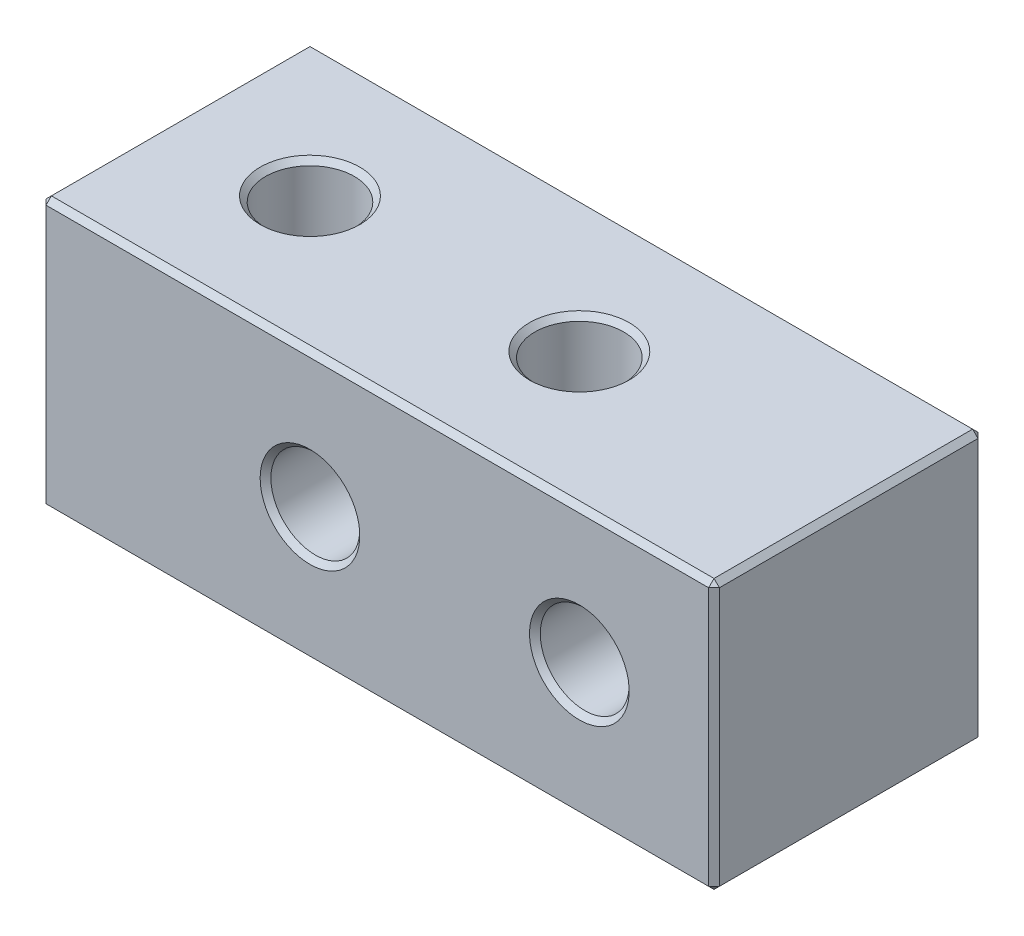
ISO-10303-21;
HEADER;
FILE_DESCRIPTION(('STEP AP214'),'2;1');
FILE_NAME('part.step','',(''),(''),'','','');
FILE_SCHEMA(('AUTOMOTIVE_DESIGN { 1 0 10303 214 1 1 1 1 }'));
ENDSEC;
DATA;
#1=APPLICATION_CONTEXT('core data for automotive mechanical design processes');
#2=APPLICATION_PROTOCOL_DEFINITION('international standard','automotive_design',2000,#1);
#3=PRODUCT_CONTEXT('',#1,'mechanical');
#4=PRODUCT('Part','Part','',(#3));
#5=PRODUCT_RELATED_PRODUCT_CATEGORY('part','',(#4));
#6=PRODUCT_DEFINITION_FORMATION('','',#4);
#7=PRODUCT_DEFINITION_CONTEXT('part definition',#1,'design');
#8=PRODUCT_DEFINITION('design','',#6,#7);
#9=PRODUCT_DEFINITION_SHAPE('','',#8);
#10=(LENGTH_UNIT() NAMED_UNIT(*) SI_UNIT(.MILLI.,.METRE.));
#11=(NAMED_UNIT(*) PLANE_ANGLE_UNIT() SI_UNIT($,.RADIAN.));
#12=(NAMED_UNIT(*) SI_UNIT($,.STERADIAN.) SOLID_ANGLE_UNIT());
#13=UNCERTAINTY_MEASURE_WITH_UNIT(LENGTH_MEASURE(1.E-05),#10,'distance_accuracy_value','');
#14=(GEOMETRIC_REPRESENTATION_CONTEXT(3) GLOBAL_UNCERTAINTY_ASSIGNED_CONTEXT((#13)) GLOBAL_UNIT_ASSIGNED_CONTEXT((#10,
#11,#12)) REPRESENTATION_CONTEXT('',''));
#15=CARTESIAN_POINT('',(0.,0.,0.));
#16=DIRECTION('',(0.,0.,1.));
#17=DIRECTION('',(1.,0.,0.));
#18=AXIS2_PLACEMENT_3D('',#15,#16,#17);
#19=CARTESIAN_POINT('',(12.5,5.,-5.));
#20=DIRECTION('',(-1.,0.,0.));
#21=DIRECTION('',(0.,0.,1.));
#22=AXIS2_PLACEMENT_3D('',#19,#20,#21);
#23=PLANE('',#22);
#24=DIRECTION('',(0.,-1.,0.));
#25=VECTOR('',#24,1.);
#26=CARTESIAN_POINT('',(12.5,5.,4.8));
#27=LINE('',#26,#25);
#28=CARTESIAN_POINT('',(12.5,4.8,4.8));
#29=VERTEX_POINT('',#28);
#30=CARTESIAN_POINT('',(12.5,-4.8,4.8));
#31=VERTEX_POINT('',#30);
#32=EDGE_CURVE('E241',#29,#31,#27,.T.);
#33=ORIENTED_EDGE('',*,*,#32,.T.);
#34=DIRECTION('',(0.,0.,-1.));
#35=VECTOR('',#34,1.);
#36=CARTESIAN_POINT('',(12.5,-4.8,-5.));
#37=LINE('',#36,#35);
#38=CARTESIAN_POINT('',(12.5,-4.8,-4.8));
#39=VERTEX_POINT('',#38);
#40=EDGE_CURVE('E243',#31,#39,#37,.T.);
#41=ORIENTED_EDGE('',*,*,#40,.T.);
#42=DIRECTION('',(0.,1.,0.));
#43=VECTOR('',#42,1.);
#44=CARTESIAN_POINT('',(12.5,5.,-4.8));
#45=LINE('',#44,#43);
#46=CARTESIAN_POINT('',(12.5,4.8,-4.8));
#47=VERTEX_POINT('',#46);
#48=EDGE_CURVE('E237',#39,#47,#45,.T.);
#49=ORIENTED_EDGE('',*,*,#48,.T.);
#50=DIRECTION('',(0.,0.,1.));
#51=VECTOR('',#50,1.);
#52=CARTESIAN_POINT('',(12.5,4.8,5.));
#53=LINE('',#52,#51);
#54=EDGE_CURVE('E239',#47,#29,#53,.T.);
#55=ORIENTED_EDGE('',*,*,#54,.T.);
#56=EDGE_LOOP('',(#33,#41,#49,#55));
#57=FACE_BOUND('',#56,.T.);
#58=ADVANCED_FACE('F41',(#57),#23,.F.);
#59=CARTESIAN_POINT('',(-12.5,5.,-5.));
#60=DIRECTION('',(0.,0.,1.));
#61=DIRECTION('',(1.,0.,0.));
#62=AXIS2_PLACEMENT_3D('',#59,#60,#61);
#63=PLANE('',#62);
#64=DIRECTION('',(1.,0.,0.));
#65=VECTOR('',#64,1.);
#66=CARTESIAN_POINT('',(12.5,4.8,-5.));
#67=LINE('',#66,#65);
#68=CARTESIAN_POINT('',(-12.3,4.8,-5.));
#69=VERTEX_POINT('',#68);
#70=CARTESIAN_POINT('',(12.3,4.8,-5.));
#71=VERTEX_POINT('',#70);
#72=EDGE_CURVE('E51',#69,#71,#67,.T.);
#73=ORIENTED_EDGE('',*,*,#72,.T.);
#74=DIRECTION('',(0.,-1.,0.));
#75=VECTOR('',#74,1.);
#76=CARTESIAN_POINT('',(12.3,5.,-5.));
#77=LINE('',#76,#75);
#78=CARTESIAN_POINT('',(12.3,-4.8,-5.));
#79=VERTEX_POINT('',#78);
#80=EDGE_CURVE('E11',#71,#79,#77,.T.);
#81=ORIENTED_EDGE('',*,*,#80,.T.);
#82=DIRECTION('',(-1.,0.,0.));
#83=VECTOR('',#82,1.);
#84=CARTESIAN_POINT('',(-12.5,-4.8,-5.));
#85=LINE('',#84,#83);
#86=CARTESIAN_POINT('',(-12.3,-4.8,-5.));
#87=VERTEX_POINT('',#86);
#88=EDGE_CURVE('E252',#79,#87,#85,.T.);
#89=ORIENTED_EDGE('',*,*,#88,.T.);
#90=DIRECTION('',(0.,1.,0.));
#91=VECTOR('',#90,1.);
#92=CARTESIAN_POINT('',(-12.3,5.,-5.));
#93=LINE('',#92,#91);
#94=EDGE_CURVE('E62',#87,#69,#93,.T.);
#95=ORIENTED_EDGE('',*,*,#94,.T.);
#96=EDGE_LOOP('',(#73,#81,#89,#95));
#97=FACE_BOUND('',#96,.T.);
#98=CARTESIAN_POINT('',(-2.49999999999999,0.,-5.));
#99=DIRECTION('',(0.,0.,1.));
#100=DIRECTION('',(1.,0.,0.));
#101=AXIS2_PLACEMENT_3D('',#98,#99,#100);
#102=CIRCLE('',#101,1.85);
#103=CARTESIAN_POINT('',(-0.649999999999993,0.,-5.));
#104=VERTEX_POINT('',#103);
#105=EDGE_CURVE('E249',#104,#104,#102,.T.);
#106=ORIENTED_EDGE('',*,*,#105,.T.);
#107=EDGE_LOOP('',(#106));
#108=FACE_BOUND('',#107,.T.);
#109=CARTESIAN_POINT('',(7.50000000000001,0.,-5.));
#110=DIRECTION('',(0.,0.,1.));
#111=DIRECTION('',(1.,0.,0.));
#112=AXIS2_PLACEMENT_3D('',#109,#110,#111);
#113=CIRCLE('',#112,1.85);
#114=CARTESIAN_POINT('',(9.35000000000001,0.,-5.));
#115=VERTEX_POINT('',#114);
#116=EDGE_CURVE('E246',#115,#115,#113,.T.);
#117=ORIENTED_EDGE('',*,*,#116,.T.);
#118=EDGE_LOOP('',(#117));
#119=FACE_BOUND('',#118,.T.);
#120=ADVANCED_FACE('F324',(#97,#108,#119),#63,.F.);
#121=CARTESIAN_POINT('',(-12.5,5.,-5.));
#122=DIRECTION('',(1.,0.,0.));
#123=DIRECTION('',(0.,0.,-1.));
#124=AXIS2_PLACEMENT_3D('',#121,#122,#123);
#125=PLANE('',#124);
#126=DIRECTION('',(0.,-1.,0.));
#127=VECTOR('',#126,1.);
#128=CARTESIAN_POINT('',(-12.5,5.,-4.8));
#129=LINE('',#128,#127);
#130=CARTESIAN_POINT('',(-12.5,4.8,-4.8));
#131=VERTEX_POINT('',#130);
#132=CARTESIAN_POINT('',(-12.5,-4.8,-4.8));
#133=VERTEX_POINT('',#132);
#134=EDGE_CURVE('E230',#131,#133,#129,.T.);
#135=ORIENTED_EDGE('',*,*,#134,.T.);
#136=DIRECTION('',(0.,0.,1.));
#137=VECTOR('',#136,1.);
#138=CARTESIAN_POINT('',(-12.5,-4.8,-5.));
#139=LINE('',#138,#137);
#140=CARTESIAN_POINT('',(-12.5,-4.8,4.8));
#141=VERTEX_POINT('',#140);
#142=EDGE_CURVE('E138',#133,#141,#139,.T.);
#143=ORIENTED_EDGE('',*,*,#142,.T.);
#144=DIRECTION('',(0.,1.,0.));
#145=VECTOR('',#144,1.);
#146=CARTESIAN_POINT('',(-12.5,5.,4.8));
#147=LINE('',#146,#145);
#148=CARTESIAN_POINT('',(-12.5,4.8,4.8));
#149=VERTEX_POINT('',#148);
#150=EDGE_CURVE('E234',#141,#149,#147,.T.);
#151=ORIENTED_EDGE('',*,*,#150,.T.);
#152=DIRECTION('',(0.,0.,-1.));
#153=VECTOR('',#152,1.);
#154=CARTESIAN_POINT('',(-12.5,4.8,-5.));
#155=LINE('',#154,#153);
#156=EDGE_CURVE('E232',#149,#131,#155,.T.);
#157=ORIENTED_EDGE('',*,*,#156,.T.);
#158=EDGE_LOOP('',(#135,#143,#151,#157));
#159=FACE_BOUND('',#158,.T.);
#160=ADVANCED_FACE('F381',(#159),#125,.F.);
#161=CARTESIAN_POINT('',(-12.5,5.,5.));
#162=DIRECTION('',(0.,0.,-1.));
#163=DIRECTION('',(-1.,0.,0.));
#164=AXIS2_PLACEMENT_3D('',#161,#162,#163);
#165=PLANE('',#164);
#166=CARTESIAN_POINT('',(-2.49999999999999,0.,5.));
#167=DIRECTION('',(0.,0.,-1.));
#168=DIRECTION('',(-1.,0.,0.));
#169=AXIS2_PLACEMENT_3D('',#166,#167,#168);
#170=CIRCLE('',#169,1.85);
#171=CARTESIAN_POINT('',(-4.34999999999999,0.,5.));
#172=VERTEX_POINT('',#171);
#173=EDGE_CURVE('E200',#172,#172,#170,.T.);
#174=ORIENTED_EDGE('',*,*,#173,.T.);
#175=EDGE_LOOP('',(#174));
#176=FACE_BOUND('',#175,.T.);
#177=CARTESIAN_POINT('',(7.50000000000001,0.,5.));
#178=DIRECTION('',(0.,0.,-1.));
#179=DIRECTION('',(-1.,0.,0.));
#180=AXIS2_PLACEMENT_3D('',#177,#178,#179);
#181=CIRCLE('',#180,1.85);
#182=CARTESIAN_POINT('',(5.65,0.,5.));
#183=VERTEX_POINT('',#182);
#184=EDGE_CURVE('E197',#183,#183,#181,.T.);
#185=ORIENTED_EDGE('',*,*,#184,.T.);
#186=EDGE_LOOP('',(#185));
#187=FACE_BOUND('',#186,.T.);
#188=DIRECTION('',(-1.,0.,0.));
#189=VECTOR('',#188,1.);
#190=CARTESIAN_POINT('',(-12.5,4.8,5.));
#191=LINE('',#190,#189);
#192=CARTESIAN_POINT('',(12.3,4.8,5.));
#193=VERTEX_POINT('',#192);
#194=CARTESIAN_POINT('',(-12.3,4.8,5.));
#195=VERTEX_POINT('',#194);
#196=EDGE_CURVE('E188',#193,#195,#191,.T.);
#197=ORIENTED_EDGE('',*,*,#196,.T.);
#198=DIRECTION('',(0.,-1.,0.));
#199=VECTOR('',#198,1.);
#200=CARTESIAN_POINT('',(-12.3,5.,5.));
#201=LINE('',#200,#199);
#202=CARTESIAN_POINT('',(-12.3,-4.8,5.));
#203=VERTEX_POINT('',#202);
#204=EDGE_CURVE('E194',#195,#203,#201,.T.);
#205=ORIENTED_EDGE('',*,*,#204,.T.);
#206=DIRECTION('',(1.,0.,0.));
#207=VECTOR('',#206,1.);
#208=CARTESIAN_POINT('',(-12.5,-4.8,5.));
#209=LINE('',#208,#207);
#210=CARTESIAN_POINT('',(12.3,-4.8,5.));
#211=VERTEX_POINT('',#210);
#212=EDGE_CURVE('E192',#203,#211,#209,.T.);
#213=ORIENTED_EDGE('',*,*,#212,.T.);
#214=DIRECTION('',(0.,1.,0.));
#215=VECTOR('',#214,1.);
#216=CARTESIAN_POINT('',(12.3,5.,5.));
#217=LINE('',#216,#215);
#218=EDGE_CURVE('E190',#211,#193,#217,.T.);
#219=ORIENTED_EDGE('',*,*,#218,.T.);
#220=EDGE_LOOP('',(#197,#205,#213,#219));
#221=FACE_BOUND('',#220,.T.);
#222=ADVANCED_FACE('F556',(#176,#187,#221),#165,.F.);
#223=CARTESIAN_POINT('',(0.,5.,0.));
#224=DIRECTION('',(0.,1.,0.));
#225=DIRECTION('',(0.,0.,1.));
#226=AXIS2_PLACEMENT_3D('',#223,#224,#225);
#227=PLANE('',#226);
#228=CARTESIAN_POINT('',(2.5,5.,0.));
#229=DIRECTION('',(0.,1.,0.));
#230=DIRECTION('',(0.,0.,1.));
#231=AXIS2_PLACEMENT_3D('',#228,#229,#230);
#232=CIRCLE('',#231,1.85);
#233=CARTESIAN_POINT('',(2.5,5.,1.85));
#234=VERTEX_POINT('',#233);
#235=EDGE_CURVE('E227',#234,#234,#232,.F.);
#236=ORIENTED_EDGE('',*,*,#235,.T.);
#237=EDGE_LOOP('',(#236));
#238=FACE_BOUND('',#237,.T.);
#239=CARTESIAN_POINT('',(-7.5,5.,0.));
#240=DIRECTION('',(0.,1.,0.));
#241=DIRECTION('',(0.,0.,1.));
#242=AXIS2_PLACEMENT_3D('',#239,#240,#241);
#243=CIRCLE('',#242,1.85);
#244=CARTESIAN_POINT('',(-7.5,5.,1.85));
#245=VERTEX_POINT('',#244);
#246=EDGE_CURVE('E224',#245,#245,#243,.F.);
#247=ORIENTED_EDGE('',*,*,#246,.T.);
#248=EDGE_LOOP('',(#247));
#249=FACE_BOUND('',#248,.T.);
#250=DIRECTION('',(0.,0.,1.));
#251=VECTOR('',#250,1.);
#252=CARTESIAN_POINT('',(-12.3,5.,5.));
#253=LINE('',#252,#251);
#254=CARTESIAN_POINT('',(-12.3,5.,-4.8));
#255=VERTEX_POINT('',#254);
#256=CARTESIAN_POINT('',(-12.3,5.,4.8));
#257=VERTEX_POINT('',#256);
#258=EDGE_CURVE('E219',#255,#257,#253,.T.);
#259=ORIENTED_EDGE('',*,*,#258,.T.);
#260=DIRECTION('',(1.,0.,0.));
#261=VECTOR('',#260,1.);
#262=CARTESIAN_POINT('',(12.5,5.,4.8));
#263=LINE('',#262,#261);
#264=CARTESIAN_POINT('',(12.3,5.,4.8));
#265=VERTEX_POINT('',#264);
#266=EDGE_CURVE('E221',#257,#265,#263,.T.);
#267=ORIENTED_EDGE('',*,*,#266,.T.);
#268=DIRECTION('',(0.,0.,-1.));
#269=VECTOR('',#268,1.);
#270=CARTESIAN_POINT('',(12.3,5.,-5.));
#271=LINE('',#270,#269);
#272=CARTESIAN_POINT('',(12.3,5.,-4.8));
#273=VERTEX_POINT('',#272);
#274=EDGE_CURVE('E217',#265,#273,#271,.T.);
#275=ORIENTED_EDGE('',*,*,#274,.T.);
#276=DIRECTION('',(-1.,0.,0.));
#277=VECTOR('',#276,1.);
#278=CARTESIAN_POINT('',(-12.5,5.,-4.8));
#279=LINE('',#278,#277);
#280=EDGE_CURVE('E215',#273,#255,#279,.T.);
#281=ORIENTED_EDGE('',*,*,#280,.T.);
#282=EDGE_LOOP('',(#259,#267,#275,#281));
#283=FACE_BOUND('',#282,.T.);
#284=ADVANCED_FACE('F338',(#238,#249,#283),#227,.T.);
#285=CARTESIAN_POINT('',(0.,-5.,0.));
#286=DIRECTION('',(0.,1.,0.));
#287=DIRECTION('',(0.,0.,1.));
#288=AXIS2_PLACEMENT_3D('',#285,#286,#287);
#289=PLANE('',#288);
#290=CARTESIAN_POINT('',(2.5,-5.,0.));
#291=DIRECTION('',(0.,1.,0.));
#292=DIRECTION('',(0.,0.,1.));
#293=AXIS2_PLACEMENT_3D('',#290,#291,#292);
#294=CIRCLE('',#293,1.85);
#295=CARTESIAN_POINT('',(2.5,-5.,1.85));
#296=VERTEX_POINT('',#295);
#297=EDGE_CURVE('E173',#296,#296,#294,.T.);
#298=ORIENTED_EDGE('',*,*,#297,.T.);
#299=EDGE_LOOP('',(#298));
#300=FACE_BOUND('',#299,.T.);
#301=CARTESIAN_POINT('',(-7.5,-5.,0.));
#302=DIRECTION('',(0.,1.,0.));
#303=DIRECTION('',(0.,0.,1.));
#304=AXIS2_PLACEMENT_3D('',#301,#302,#303);
#305=CIRCLE('',#304,1.85);
#306=CARTESIAN_POINT('',(-7.5,-5.,1.85));
#307=VERTEX_POINT('',#306);
#308=EDGE_CURVE('E167',#307,#307,#305,.T.);
#309=ORIENTED_EDGE('',*,*,#308,.T.);
#310=EDGE_LOOP('',(#309));
#311=FACE_BOUND('',#310,.T.);
#312=DIRECTION('',(0.,0.,1.));
#313=VECTOR('',#312,1.);
#314=CARTESIAN_POINT('',(12.3,-5.,0.));
#315=LINE('',#314,#313);
#316=CARTESIAN_POINT('',(12.3,-5.,-4.8));
#317=VERTEX_POINT('',#316);
#318=CARTESIAN_POINT('',(12.3,-5.,4.8));
#319=VERTEX_POINT('',#318);
#320=EDGE_CURVE('E160',#317,#319,#315,.T.);
#321=ORIENTED_EDGE('',*,*,#320,.T.);
#322=DIRECTION('',(-1.,0.,0.));
#323=VECTOR('',#322,1.);
#324=CARTESIAN_POINT('',(0.,-5.,4.8));
#325=LINE('',#324,#323);
#326=CARTESIAN_POINT('',(-12.3,-5.,4.8));
#327=VERTEX_POINT('',#326);
#328=EDGE_CURVE('E164',#319,#327,#325,.T.);
#329=ORIENTED_EDGE('',*,*,#328,.T.);
#330=DIRECTION('',(0.,0.,-1.));
#331=VECTOR('',#330,1.);
#332=CARTESIAN_POINT('',(-12.3,-5.,0.));
#333=LINE('',#332,#331);
#334=CARTESIAN_POINT('',(-12.3,-5.,-4.8));
#335=VERTEX_POINT('',#334);
#336=EDGE_CURVE('E135',#327,#335,#333,.T.);
#337=ORIENTED_EDGE('',*,*,#336,.T.);
#338=DIRECTION('',(1.,0.,0.));
#339=VECTOR('',#338,1.);
#340=CARTESIAN_POINT('',(0.,-5.,-4.8));
#341=LINE('',#340,#339);
#342=EDGE_CURVE('E154',#335,#317,#341,.T.);
#343=ORIENTED_EDGE('',*,*,#342,.T.);
#344=EDGE_LOOP('',(#321,#329,#337,#343));
#345=FACE_BOUND('',#344,.T.);
#346=ADVANCED_FACE('F162',(#300,#311,#345),#289,.F.);
#347=CARTESIAN_POINT('',(2.5,5.,0.));
#348=DIRECTION('',(0.,1.,0.));
#349=DIRECTION('',(0.,0.,1.));
#350=AXIS2_PLACEMENT_3D('',#347,#348,#349);
#351=CYLINDRICAL_SURFACE('',#350,1.65);
#352=CARTESIAN_POINT('',(2.5,-4.8,0.));
#353=DIRECTION('',(0.,1.,0.));
#354=DIRECTION('',(0.,0.,1.));
#355=AXIS2_PLACEMENT_3D('',#352,#353,#354);
#356=CIRCLE('',#355,1.65);
#357=CARTESIAN_POINT('',(2.5,-4.8,1.65));
#358=VERTEX_POINT('',#357);
#359=EDGE_CURVE('E179',#358,#358,#356,.F.);
#360=ORIENTED_EDGE('',*,*,#359,.T.);
#361=EDGE_LOOP('',(#360));
#362=FACE_BOUND('',#361,.T.);
#363=CARTESIAN_POINT('',(2.5,4.8,0.));
#364=DIRECTION('',(0.,1.,0.));
#365=DIRECTION('',(0.,0.,1.));
#366=AXIS2_PLACEMENT_3D('',#363,#364,#365);
#367=CIRCLE('',#366,1.65);
#368=CARTESIAN_POINT('',(2.5,4.8,1.65));
#369=VERTEX_POINT('',#368);
#370=EDGE_CURVE('E176',#369,#369,#367,.T.);
#371=ORIENTED_EDGE('',*,*,#370,.T.);
#372=EDGE_LOOP('',(#371));
#373=FACE_BOUND('',#372,.T.);
#374=ADVANCED_FACE('F547',(#362,#373),#351,.F.);
#375=CARTESIAN_POINT('',(-7.5,5.,0.));
#376=DIRECTION('',(0.,1.,0.));
#377=DIRECTION('',(0.,0.,1.));
#378=AXIS2_PLACEMENT_3D('',#375,#376,#377);
#379=CYLINDRICAL_SURFACE('',#378,1.65);
#380=CARTESIAN_POINT('',(-7.5,-4.8,0.));
#381=DIRECTION('',(0.,1.,0.));
#382=DIRECTION('',(0.,0.,1.));
#383=AXIS2_PLACEMENT_3D('',#380,#381,#382);
#384=CIRCLE('',#383,1.65);
#385=CARTESIAN_POINT('',(-7.5,-4.8,1.65));
#386=VERTEX_POINT('',#385);
#387=EDGE_CURVE('E185',#386,#386,#384,.F.);
#388=ORIENTED_EDGE('',*,*,#387,.T.);
#389=EDGE_LOOP('',(#388));
#390=FACE_BOUND('',#389,.T.);
#391=CARTESIAN_POINT('',(-7.5,4.8,0.));
#392=DIRECTION('',(0.,1.,0.));
#393=DIRECTION('',(0.,0.,1.));
#394=AXIS2_PLACEMENT_3D('',#391,#392,#393);
#395=CIRCLE('',#394,1.65);
#396=CARTESIAN_POINT('',(-7.5,4.8,1.65));
#397=VERTEX_POINT('',#396);
#398=EDGE_CURVE('E182',#397,#397,#395,.T.);
#399=ORIENTED_EDGE('',*,*,#398,.T.);
#400=EDGE_LOOP('',(#399));
#401=FACE_BOUND('',#400,.T.);
#402=ADVANCED_FACE('F538',(#390,#401),#379,.F.);
#403=CARTESIAN_POINT('',(-2.49999999999999,0.,-5.));
#404=DIRECTION('',(0.,0.,-1.));
#405=DIRECTION('',(-1.,0.,0.));
#406=AXIS2_PLACEMENT_3D('',#403,#404,#405);
#407=CYLINDRICAL_SURFACE('',#406,1.65);
#408=CARTESIAN_POINT('',(-2.49999999999999,0.,4.8));
#409=DIRECTION('',(0.,0.,-1.));
#410=DIRECTION('',(-1.,0.,0.));
#411=AXIS2_PLACEMENT_3D('',#408,#409,#410);
#412=CIRCLE('',#411,1.65);
#413=CARTESIAN_POINT('',(-4.14999999999999,0.,4.8));
#414=VERTEX_POINT('',#413);
#415=EDGE_CURVE('E206',#414,#414,#412,.F.);
#416=ORIENTED_EDGE('',*,*,#415,.T.);
#417=EDGE_LOOP('',(#416));
#418=FACE_BOUND('',#417,.T.);
#419=CARTESIAN_POINT('',(-2.49999999999999,0.,-4.8));
#420=DIRECTION('',(0.,0.,1.));
#421=DIRECTION('',(1.,0.,0.));
#422=AXIS2_PLACEMENT_3D('',#419,#420,#421);
#423=CIRCLE('',#422,1.65);
#424=CARTESIAN_POINT('',(-0.849999999999996,0.,-4.8));
#425=VERTEX_POINT('',#424);
#426=EDGE_CURVE('E203',#425,#425,#423,.F.);
#427=ORIENTED_EDGE('',*,*,#426,.T.);
#428=EDGE_LOOP('',(#427));
#429=FACE_BOUND('',#428,.T.);
#430=ADVANCED_FACE('F536',(#418,#429),#407,.F.);
#431=CARTESIAN_POINT('',(7.50000000000001,0.,-5.));
#432=DIRECTION('',(0.,0.,-1.));
#433=DIRECTION('',(-1.,0.,0.));
#434=AXIS2_PLACEMENT_3D('',#431,#432,#433);
#435=CYLINDRICAL_SURFACE('',#434,1.65);
#436=CARTESIAN_POINT('',(7.50000000000001,0.,4.8));
#437=DIRECTION('',(0.,0.,-1.));
#438=DIRECTION('',(-1.,0.,0.));
#439=AXIS2_PLACEMENT_3D('',#436,#437,#438);
#440=CIRCLE('',#439,1.65);
#441=CARTESIAN_POINT('',(5.85000000000001,0.,4.8));
#442=VERTEX_POINT('',#441);
#443=EDGE_CURVE('E212',#442,#442,#440,.F.);
#444=ORIENTED_EDGE('',*,*,#443,.T.);
#445=EDGE_LOOP('',(#444));
#446=FACE_BOUND('',#445,.T.);
#447=CARTESIAN_POINT('',(7.50000000000001,0.,-4.8));
#448=DIRECTION('',(0.,0.,1.));
#449=DIRECTION('',(1.,0.,0.));
#450=AXIS2_PLACEMENT_3D('',#447,#448,#449);
#451=CIRCLE('',#450,1.65);
#452=CARTESIAN_POINT('',(9.15000000000001,0.,-4.8));
#453=VERTEX_POINT('',#452);
#454=EDGE_CURVE('E209',#453,#453,#451,.F.);
#455=ORIENTED_EDGE('',*,*,#454,.T.);
#456=EDGE_LOOP('',(#455));
#457=FACE_BOUND('',#456,.T.);
#458=ADVANCED_FACE('F393',(#446,#457),#435,.F.);
#459=CARTESIAN_POINT('',(2.5,-5.,0.));
#460=DIRECTION('',(0.,-1.,0.));
#461=DIRECTION('',(0.,0.,-1.));
#462=AXIS2_PLACEMENT_3D('',#459,#460,#461);
#463=CONICAL_SURFACE('',#462,1.85,0.785398163397445);
#464=ORIENTED_EDGE('',*,*,#359,.F.);
#465=EDGE_LOOP('',(#464));
#466=FACE_BOUND('',#465,.T.);
#467=ORIENTED_EDGE('',*,*,#297,.F.);
#468=EDGE_LOOP('',(#467));
#469=FACE_BOUND('',#468,.T.);
#470=ADVANCED_FACE('F386',(#466,#469),#463,.F.);
#471=CARTESIAN_POINT('',(-7.5,-5.,0.));
#472=DIRECTION('',(0.,-1.,0.));
#473=DIRECTION('',(0.,0.,-1.));
#474=AXIS2_PLACEMENT_3D('',#471,#472,#473);
#475=CONICAL_SURFACE('',#474,1.85,0.785398163397445);
#476=ORIENTED_EDGE('',*,*,#387,.F.);
#477=EDGE_LOOP('',(#476));
#478=FACE_BOUND('',#477,.T.);
#479=ORIENTED_EDGE('',*,*,#308,.F.);
#480=EDGE_LOOP('',(#479));
#481=FACE_BOUND('',#480,.T.);
#482=ADVANCED_FACE('F392',(#478,#481),#475,.F.);
#483=CARTESIAN_POINT('',(-2.49999999999999,0.,5.));
#484=DIRECTION('',(0.,0.,1.));
#485=DIRECTION('',(1.,0.,0.));
#486=AXIS2_PLACEMENT_3D('',#483,#484,#485);
#487=CONICAL_SURFACE('',#486,1.85,0.785398163397445);
#488=ORIENTED_EDGE('',*,*,#415,.F.);
#489=EDGE_LOOP('',(#488));
#490=FACE_BOUND('',#489,.T.);
#491=ORIENTED_EDGE('',*,*,#173,.F.);
#492=EDGE_LOOP('',(#491));
#493=FACE_BOUND('',#492,.T.);
#494=ADVANCED_FACE('F400',(#490,#493),#487,.F.);
#495=CARTESIAN_POINT('',(7.50000000000001,0.,5.));
#496=DIRECTION('',(0.,0.,1.));
#497=DIRECTION('',(1.,0.,0.));
#498=AXIS2_PLACEMENT_3D('',#495,#496,#497);
#499=CONICAL_SURFACE('',#498,1.85,0.785398163397455);
#500=ORIENTED_EDGE('',*,*,#443,.F.);
#501=EDGE_LOOP('',(#500));
#502=FACE_BOUND('',#501,.T.);
#503=ORIENTED_EDGE('',*,*,#184,.F.);
#504=EDGE_LOOP('',(#503));
#505=FACE_BOUND('',#504,.T.);
#506=ADVANCED_FACE('F407',(#502,#505),#499,.F.);
#507=CARTESIAN_POINT('',(2.5,4.8,0.));
#508=DIRECTION('',(0.,1.,0.));
#509=DIRECTION('',(0.,0.,1.));
#510=AXIS2_PLACEMENT_3D('',#507,#508,#509);
#511=CONICAL_SURFACE('',#510,1.65,0.785398163397451);
#512=ORIENTED_EDGE('',*,*,#235,.F.);
#513=EDGE_LOOP('',(#512));
#514=FACE_BOUND('',#513,.T.);
#515=ORIENTED_EDGE('',*,*,#370,.F.);
#516=EDGE_LOOP('',(#515));
#517=FACE_BOUND('',#516,.T.);
#518=ADVANCED_FACE('F414',(#514,#517),#511,.F.);
#519=CARTESIAN_POINT('',(-7.5,4.8,0.));
#520=DIRECTION('',(0.,1.,0.));
#521=DIRECTION('',(0.,0.,1.));
#522=AXIS2_PLACEMENT_3D('',#519,#520,#521);
#523=CONICAL_SURFACE('',#522,1.65,0.785398163397451);
#524=ORIENTED_EDGE('',*,*,#246,.F.);
#525=EDGE_LOOP('',(#524));
#526=FACE_BOUND('',#525,.T.);
#527=ORIENTED_EDGE('',*,*,#398,.F.);
#528=EDGE_LOOP('',(#527));
#529=FACE_BOUND('',#528,.T.);
#530=ADVANCED_FACE('F421',(#526,#529),#523,.F.);
#531=CARTESIAN_POINT('',(12.3,5.,0.));
#532=DIRECTION('',(0.707106781186547,0.707106781186547,0.));
#533=DIRECTION('',(0.,0.,1.));
#534=AXIS2_PLACEMENT_3D('',#531,#532,#533);
#535=PLANE('',#534);
#536=DIRECTION('',(0.707106781186547,-0.707106781186547,0.));
#537=VECTOR('',#536,1.);
#538=CARTESIAN_POINT('',(12.3,5.,-4.8));
#539=LINE('',#538,#537);
#540=EDGE_CURVE('E46',#273,#47,#539,.T.);
#541=ORIENTED_EDGE('',*,*,#540,.F.);
#542=ORIENTED_EDGE('',*,*,#274,.F.);
#543=DIRECTION('',(-0.707106781186547,0.707106781186547,0.));
#544=VECTOR('',#543,1.);
#545=CARTESIAN_POINT('',(12.4,4.9,4.8));
#546=LINE('',#545,#544);
#547=EDGE_CURVE('E303',#29,#265,#546,.T.);
#548=ORIENTED_EDGE('',*,*,#547,.F.);
#549=ORIENTED_EDGE('',*,*,#54,.F.);
#550=EDGE_LOOP('',(#541,#542,#548,#549));
#551=FACE_BOUND('',#550,.T.);
#552=ADVANCED_FACE('F428',(#551),#535,.T.);
#553=CARTESIAN_POINT('',(12.3,5.,-4.8));
#554=DIRECTION('',(0.577350269189626,0.577350269189626,-0.577350269189626));
#555=DIRECTION('',(-0.707106781186547,0.,-0.707106781186547));
#556=AXIS2_PLACEMENT_3D('',#553,#554,#555);
#557=PLANE('',#556);
#558=DIRECTION('',(0.,0.707106781186547,0.707106781186547));
#559=VECTOR('',#558,1.);
#560=CARTESIAN_POINT('',(12.3,5.,-4.8));
#561=LINE('',#560,#559);
#562=EDGE_CURVE('E299',#273,#71,#561,.F.);
#563=ORIENTED_EDGE('',*,*,#562,.F.);
#564=ORIENTED_EDGE('',*,*,#540,.T.);
#565=DIRECTION('',(0.707106781186547,0.,0.707106781186547));
#566=VECTOR('',#565,1.);
#567=CARTESIAN_POINT('',(12.4,4.8,-4.9));
#568=LINE('',#567,#566);
#569=EDGE_CURVE('E301',#71,#47,#568,.T.);
#570=ORIENTED_EDGE('',*,*,#569,.F.);
#571=EDGE_LOOP('',(#563,#564,#570));
#572=FACE_BOUND('',#571,.T.);
#573=ADVANCED_FACE('F315',(#572),#557,.T.);
#574=CARTESIAN_POINT('',(12.3,4.8,5.));
#575=DIRECTION('',(0.577350269189626,0.577350269189626,0.577350269189626));
#576=DIRECTION('',(0.707106781186547,0.,-0.707106781186547));
#577=AXIS2_PLACEMENT_3D('',#574,#575,#576);
#578=PLANE('',#577);
#579=DIRECTION('',(-0.707106781186547,0.,0.707106781186547));
#580=VECTOR('',#579,1.);
#581=CARTESIAN_POINT('',(12.3,4.8,5.));
#582=LINE('',#581,#580);
#583=EDGE_CURVE('E294',#29,#193,#582,.T.);
#584=ORIENTED_EDGE('',*,*,#583,.F.);
#585=ORIENTED_EDGE('',*,*,#547,.T.);
#586=DIRECTION('',(0.,-0.707106781186547,0.707106781186547));
#587=VECTOR('',#586,1.);
#588=CARTESIAN_POINT('',(12.3,4.8,5.));
#589=LINE('',#588,#587);
#590=EDGE_CURVE('E297',#193,#265,#589,.F.);
#591=ORIENTED_EDGE('',*,*,#590,.F.);
#592=EDGE_LOOP('',(#584,#585,#591));
#593=FACE_BOUND('',#592,.T.);
#594=ADVANCED_FACE('F352',(#593),#578,.T.);
#595=CARTESIAN_POINT('',(12.3,5.,-5.));
#596=DIRECTION('',(-0.707106781186547,0.,0.707106781186547));
#597=DIRECTION('',(0.,-1.,0.));
#598=AXIS2_PLACEMENT_3D('',#595,#596,#597);
#599=PLANE('',#598);
#600=ORIENTED_EDGE('',*,*,#569,.T.);
#601=ORIENTED_EDGE('',*,*,#48,.F.);
#602=DIRECTION('',(-0.707106781186547,0.,-0.707106781186547));
#603=VECTOR('',#602,1.);
#604=CARTESIAN_POINT('',(12.5,-4.8,-4.8));
#605=LINE('',#604,#603);
#606=EDGE_CURVE('E289',#79,#39,#605,.F.);
#607=ORIENTED_EDGE('',*,*,#606,.F.);
#608=ORIENTED_EDGE('',*,*,#80,.F.);
#609=EDGE_LOOP('',(#600,#601,#607,#608));
#610=FACE_BOUND('',#609,.T.);
#611=ADVANCED_FACE('F322',(#610),#599,.F.);
#612=CARTESIAN_POINT('',(0.,5.,-4.8));
#613=DIRECTION('',(0.,0.707106781186547,-0.707106781186547));
#614=DIRECTION('',(1.,0.,0.));
#615=AXIS2_PLACEMENT_3D('',#612,#613,#614);
#616=PLANE('',#615);
#617=ORIENTED_EDGE('',*,*,#562,.T.);
#618=ORIENTED_EDGE('',*,*,#72,.F.);
#619=DIRECTION('',(0.,-0.707106781186547,-0.707106781186547));
#620=VECTOR('',#619,1.);
#621=CARTESIAN_POINT('',(-12.3,4.9,-4.9));
#622=LINE('',#621,#620);
#623=EDGE_CURVE('E286',#255,#69,#622,.T.);
#624=ORIENTED_EDGE('',*,*,#623,.F.);
#625=ORIENTED_EDGE('',*,*,#280,.F.);
#626=EDGE_LOOP('',(#617,#618,#624,#625));
#627=FACE_BOUND('',#626,.T.);
#628=ADVANCED_FACE('F335',(#627),#616,.T.);
#629=CARTESIAN_POINT('',(-12.3,5.,0.));
#630=DIRECTION('',(-0.707106781186547,0.707106781186547,0.));
#631=DIRECTION('',(0.,0.,-1.));
#632=AXIS2_PLACEMENT_3D('',#629,#630,#631);
#633=PLANE('',#632);
#634=DIRECTION('',(-0.707106781186547,-0.707106781186547,0.));
#635=VECTOR('',#634,1.);
#636=CARTESIAN_POINT('',(-12.5,4.8,4.8));
#637=LINE('',#636,#635);
#638=EDGE_CURVE('E280',#257,#149,#637,.T.);
#639=ORIENTED_EDGE('',*,*,#638,.F.);
#640=ORIENTED_EDGE('',*,*,#258,.F.);
#641=DIRECTION('',(0.707106781186547,0.707106781186547,0.));
#642=VECTOR('',#641,1.);
#643=CARTESIAN_POINT('',(-12.5,4.8,-4.8));
#644=LINE('',#643,#642);
#645=EDGE_CURVE('E283',#131,#255,#644,.T.);
#646=ORIENTED_EDGE('',*,*,#645,.F.);
#647=ORIENTED_EDGE('',*,*,#156,.F.);
#648=EDGE_LOOP('',(#639,#640,#646,#647));
#649=FACE_BOUND('',#648,.T.);
#650=ADVANCED_FACE('F342',(#649),#633,.T.);
#651=CARTESIAN_POINT('',(0.,5.,4.8));
#652=DIRECTION('',(0.,0.707106781186547,0.707106781186547));
#653=DIRECTION('',(-1.,0.,0.));
#654=AXIS2_PLACEMENT_3D('',#651,#652,#653);
#655=PLANE('',#654);
#656=ORIENTED_EDGE('',*,*,#590,.T.);
#657=ORIENTED_EDGE('',*,*,#266,.F.);
#658=DIRECTION('',(0.,0.707106781186547,-0.707106781186547));
#659=VECTOR('',#658,1.);
#660=CARTESIAN_POINT('',(-12.3,4.9,4.9));
#661=LINE('',#660,#659);
#662=EDGE_CURVE('E277',#195,#257,#661,.T.);
#663=ORIENTED_EDGE('',*,*,#662,.F.);
#664=ORIENTED_EDGE('',*,*,#196,.F.);
#665=EDGE_LOOP('',(#656,#657,#663,#664));
#666=FACE_BOUND('',#665,.T.);
#667=ADVANCED_FACE('F351',(#666),#655,.T.);
#668=CARTESIAN_POINT('',(12.5,5.,4.8));
#669=DIRECTION('',(-0.707106781186547,0.,-0.707106781186547));
#670=DIRECTION('',(0.,-1.,0.));
#671=AXIS2_PLACEMENT_3D('',#668,#669,#670);
#672=PLANE('',#671);
#673=ORIENTED_EDGE('',*,*,#583,.T.);
#674=ORIENTED_EDGE('',*,*,#218,.F.);
#675=DIRECTION('',(0.707106781186547,0.,-0.707106781186547));
#676=VECTOR('',#675,1.);
#677=CARTESIAN_POINT('',(12.4,-4.8,4.9));
#678=LINE('',#677,#676);
#679=EDGE_CURVE('E274',#31,#211,#678,.F.);
#680=ORIENTED_EDGE('',*,*,#679,.F.);
#681=ORIENTED_EDGE('',*,*,#32,.F.);
#682=EDGE_LOOP('',(#673,#674,#680,#681));
#683=FACE_BOUND('',#682,.T.);
#684=ADVANCED_FACE('F357',(#683),#672,.F.);
#685=CARTESIAN_POINT('',(12.5,-4.8,-5.));
#686=DIRECTION('',(-0.707106781186547,0.707106781186547,0.));
#687=DIRECTION('',(0.,0.,-1.));
#688=AXIS2_PLACEMENT_3D('',#685,#686,#687);
#689=PLANE('',#688);
#690=DIRECTION('',(0.707106781186547,0.707106781186547,0.));
#691=VECTOR('',#690,1.);
#692=CARTESIAN_POINT('',(12.5,-4.8,-4.8));
#693=LINE('',#692,#691);
#694=EDGE_CURVE('E291',#39,#317,#693,.F.);
#695=ORIENTED_EDGE('',*,*,#694,.F.);
#696=ORIENTED_EDGE('',*,*,#40,.F.);
#697=DIRECTION('',(-0.707106781186547,-0.707106781186547,0.));
#698=VECTOR('',#697,1.);
#699=CARTESIAN_POINT('',(12.3,-5.,4.8));
#700=LINE('',#699,#698);
#701=EDGE_CURVE('E271',#319,#31,#700,.F.);
#702=ORIENTED_EDGE('',*,*,#701,.F.);
#703=ORIENTED_EDGE('',*,*,#320,.F.);
#704=EDGE_LOOP('',(#695,#696,#702,#703));
#705=FACE_BOUND('',#704,.T.);
#706=ADVANCED_FACE('F363',(#705),#689,.F.);
#707=CARTESIAN_POINT('',(12.5,-4.8,-4.8));
#708=DIRECTION('',(0.577350269189626,-0.577350269189626,-0.577350269189626));
#709=DIRECTION('',(-0.707106781186547,0.,-0.707106781186547));
#710=AXIS2_PLACEMENT_3D('',#707,#708,#709);
#711=PLANE('',#710);
#712=ORIENTED_EDGE('',*,*,#606,.T.);
#713=ORIENTED_EDGE('',*,*,#694,.T.);
#714=DIRECTION('',(0.,-0.707106781186547,0.707106781186547));
#715=VECTOR('',#714,1.);
#716=CARTESIAN_POINT('',(12.3,-4.9,-4.9));
#717=LINE('',#716,#715);
#718=EDGE_CURVE('E157',#79,#317,#717,.T.);
#719=ORIENTED_EDGE('',*,*,#718,.F.);
#720=EDGE_LOOP('',(#712,#713,#719));
#721=FACE_BOUND('',#720,.T.);
#722=ADVANCED_FACE('F366',(#721),#711,.T.);
#723=CARTESIAN_POINT('',(-12.5,4.8,-4.8));
#724=DIRECTION('',(-0.577350269189626,0.577350269189626,-0.577350269189626));
#725=DIRECTION('',(-0.707106781186547,0.,0.707106781186547));
#726=AXIS2_PLACEMENT_3D('',#723,#724,#725);
#727=PLANE('',#726);
#728=ORIENTED_EDGE('',*,*,#645,.T.);
#729=ORIENTED_EDGE('',*,*,#623,.T.);
#730=DIRECTION('',(0.707106781186547,0.,-0.707106781186547));
#731=VECTOR('',#730,1.);
#732=CARTESIAN_POINT('',(-12.5,4.8,-4.8));
#733=LINE('',#732,#731);
#734=EDGE_CURVE('E267',#131,#69,#733,.T.);
#735=ORIENTED_EDGE('',*,*,#734,.F.);
#736=EDGE_LOOP('',(#728,#729,#735));
#737=FACE_BOUND('',#736,.T.);
#738=ADVANCED_FACE('F331',(#737),#727,.T.);
#739=CARTESIAN_POINT('',(-12.5,4.8,4.8));
#740=DIRECTION('',(-0.577350269189626,0.577350269189626,0.577350269189626));
#741=DIRECTION('',(0.707106781186547,0.,0.707106781186547));
#742=AXIS2_PLACEMENT_3D('',#739,#740,#741);
#743=PLANE('',#742);
#744=ORIENTED_EDGE('',*,*,#662,.T.);
#745=ORIENTED_EDGE('',*,*,#638,.T.);
#746=DIRECTION('',(-0.707106781186547,0.,-0.707106781186547));
#747=VECTOR('',#746,1.);
#748=CARTESIAN_POINT('',(-12.5,4.8,4.8));
#749=LINE('',#748,#747);
#750=EDGE_CURVE('E264',#195,#149,#749,.T.);
#751=ORIENTED_EDGE('',*,*,#750,.F.);
#752=EDGE_LOOP('',(#744,#745,#751));
#753=FACE_BOUND('',#752,.T.);
#754=ADVANCED_FACE('F347',(#753),#743,.T.);
#755=CARTESIAN_POINT('',(12.3,-5.,4.8));
#756=DIRECTION('',(0.577350269189626,-0.577350269189626,0.577350269189626));
#757=DIRECTION('',(0.707106781186547,0.,-0.707106781186547));
#758=AXIS2_PLACEMENT_3D('',#755,#756,#757);
#759=PLANE('',#758);
#760=ORIENTED_EDGE('',*,*,#701,.T.);
#761=ORIENTED_EDGE('',*,*,#679,.T.);
#762=DIRECTION('',(0.,0.707106781186547,0.707106781186547));
#763=VECTOR('',#762,1.);
#764=CARTESIAN_POINT('',(12.3,-5.,4.8));
#765=LINE('',#764,#763);
#766=EDGE_CURVE('E151',#319,#211,#765,.T.);
#767=ORIENTED_EDGE('',*,*,#766,.F.);
#768=EDGE_LOOP('',(#760,#761,#767));
#769=FACE_BOUND('',#768,.T.);
#770=ADVANCED_FACE('F474',(#769),#759,.T.);
#771=CARTESIAN_POINT('',(-12.5,-4.8,-5.));
#772=DIRECTION('',(0.,0.707106781186547,0.707106781186547));
#773=DIRECTION('',(-1.,0.,0.));
#774=AXIS2_PLACEMENT_3D('',#771,#772,#773);
#775=PLANE('',#774);
#776=ORIENTED_EDGE('',*,*,#718,.T.);
#777=ORIENTED_EDGE('',*,*,#342,.F.);
#778=DIRECTION('',(0.,0.707106781186547,-0.707106781186547));
#779=VECTOR('',#778,1.);
#780=CARTESIAN_POINT('',(-12.3,-5.,-4.8));
#781=LINE('',#780,#779);
#782=EDGE_CURVE('E145',#87,#335,#781,.F.);
#783=ORIENTED_EDGE('',*,*,#782,.F.);
#784=ORIENTED_EDGE('',*,*,#88,.F.);
#785=EDGE_LOOP('',(#776,#777,#783,#784));
#786=FACE_BOUND('',#785,.T.);
#787=ADVANCED_FACE('F155',(#786),#775,.F.);
#788=CARTESIAN_POINT('',(-12.5,5.,-4.8));
#789=DIRECTION('',(0.707106781186547,0.,0.707106781186547));
#790=DIRECTION('',(0.,-1.,0.));
#791=AXIS2_PLACEMENT_3D('',#788,#789,#790);
#792=PLANE('',#791);
#793=ORIENTED_EDGE('',*,*,#734,.T.);
#794=ORIENTED_EDGE('',*,*,#94,.F.);
#795=DIRECTION('',(-0.707106781186547,0.,0.707106781186547));
#796=VECTOR('',#795,1.);
#797=CARTESIAN_POINT('',(-12.4,-4.8,-4.9));
#798=LINE('',#797,#796);
#799=EDGE_CURVE('E149',#133,#87,#798,.F.);
#800=ORIENTED_EDGE('',*,*,#799,.F.);
#801=ORIENTED_EDGE('',*,*,#134,.F.);
#802=EDGE_LOOP('',(#793,#794,#800,#801));
#803=FACE_BOUND('',#802,.T.);
#804=ADVANCED_FACE('F327',(#803),#792,.F.);
#805=CARTESIAN_POINT('',(-12.3,5.,5.));
#806=DIRECTION('',(0.707106781186547,0.,-0.707106781186547));
#807=DIRECTION('',(0.,-1.,0.));
#808=AXIS2_PLACEMENT_3D('',#805,#806,#807);
#809=PLANE('',#808);
#810=ORIENTED_EDGE('',*,*,#750,.T.);
#811=ORIENTED_EDGE('',*,*,#150,.F.);
#812=DIRECTION('',(0.707106781186547,0.,0.707106781186547));
#813=VECTOR('',#812,1.);
#814=CARTESIAN_POINT('',(-12.5,-4.8,4.8));
#815=LINE('',#814,#813);
#816=EDGE_CURVE('E258',#203,#141,#815,.F.);
#817=ORIENTED_EDGE('',*,*,#816,.F.);
#818=ORIENTED_EDGE('',*,*,#204,.F.);
#819=EDGE_LOOP('',(#810,#811,#817,#818));
#820=FACE_BOUND('',#819,.T.);
#821=ADVANCED_FACE('F456',(#820),#809,.F.);
#822=CARTESIAN_POINT('',(-12.5,-4.8,5.));
#823=DIRECTION('',(0.,0.707106781186547,-0.707106781186547));
#824=DIRECTION('',(1.,0.,0.));
#825=AXIS2_PLACEMENT_3D('',#822,#823,#824);
#826=PLANE('',#825);
#827=ORIENTED_EDGE('',*,*,#766,.T.);
#828=ORIENTED_EDGE('',*,*,#212,.F.);
#829=DIRECTION('',(0.,-0.707106781186547,-0.707106781186547));
#830=VECTOR('',#829,1.);
#831=CARTESIAN_POINT('',(-12.3,-4.9,4.9));
#832=LINE('',#831,#830);
#833=EDGE_CURVE('E141',#327,#203,#832,.F.);
#834=ORIENTED_EDGE('',*,*,#833,.F.);
#835=ORIENTED_EDGE('',*,*,#328,.F.);
#836=EDGE_LOOP('',(#827,#828,#834,#835));
#837=FACE_BOUND('',#836,.T.);
#838=ADVANCED_FACE('F450',(#837),#826,.F.);
#839=CARTESIAN_POINT('',(-12.3,-5.,-4.8));
#840=DIRECTION('',(-0.577350269189626,-0.577350269189626,-0.577350269189626));
#841=DIRECTION('',(-0.707106781186547,0.,0.707106781186547));
#842=AXIS2_PLACEMENT_3D('',#839,#840,#841);
#843=PLANE('',#842);
#844=ORIENTED_EDGE('',*,*,#799,.T.);
#845=ORIENTED_EDGE('',*,*,#782,.T.);
#846=DIRECTION('',(0.707106781186547,-0.707106781186547,0.));
#847=VECTOR('',#846,1.);
#848=CARTESIAN_POINT('',(-12.3,-5.,-4.8));
#849=LINE('',#848,#847);
#850=EDGE_CURVE('E131',#133,#335,#849,.T.);
#851=ORIENTED_EDGE('',*,*,#850,.F.);
#852=EDGE_LOOP('',(#844,#845,#851));
#853=FACE_BOUND('',#852,.T.);
#854=ADVANCED_FACE('F147',(#853),#843,.T.);
#855=CARTESIAN_POINT('',(-12.5,-4.8,4.8));
#856=DIRECTION('',(-0.577350269189626,-0.577350269189626,0.577350269189626));
#857=DIRECTION('',(0.707106781186547,0.,0.707106781186547));
#858=AXIS2_PLACEMENT_3D('',#855,#856,#857);
#859=PLANE('',#858);
#860=ORIENTED_EDGE('',*,*,#833,.T.);
#861=ORIENTED_EDGE('',*,*,#816,.T.);
#862=DIRECTION('',(-0.707106781186547,0.707106781186547,0.));
#863=VECTOR('',#862,1.);
#864=CARTESIAN_POINT('',(-12.5,-4.8,4.8));
#865=LINE('',#864,#863);
#866=EDGE_CURVE('E142',#327,#141,#865,.T.);
#867=ORIENTED_EDGE('',*,*,#866,.F.);
#868=EDGE_LOOP('',(#860,#861,#867));
#869=FACE_BOUND('',#868,.T.);
#870=ADVANCED_FACE('F438',(#869),#859,.T.);
#871=CARTESIAN_POINT('',(-12.5,-4.8,-5.));
#872=DIRECTION('',(0.707106781186547,0.707106781186547,0.));
#873=DIRECTION('',(0.,0.,1.));
#874=AXIS2_PLACEMENT_3D('',#871,#872,#873);
#875=PLANE('',#874);
#876=ORIENTED_EDGE('',*,*,#850,.T.);
#877=ORIENTED_EDGE('',*,*,#336,.F.);
#878=ORIENTED_EDGE('',*,*,#866,.T.);
#879=ORIENTED_EDGE('',*,*,#142,.F.);
#880=EDGE_LOOP('',(#876,#877,#878,#879));
#881=FACE_BOUND('',#880,.T.);
#882=ADVANCED_FACE('F133',(#881),#875,.F.);
#883=CARTESIAN_POINT('',(-2.49999999999999,0.,-4.8));
#884=DIRECTION('',(0.,0.,-1.));
#885=DIRECTION('',(-1.,0.,0.));
#886=AXIS2_PLACEMENT_3D('',#883,#884,#885);
#887=CONICAL_SURFACE('',#886,1.65,0.785398163397453);
#888=ORIENTED_EDGE('',*,*,#105,.F.);
#889=EDGE_LOOP('',(#888));
#890=FACE_BOUND('',#889,.T.);
#891=ORIENTED_EDGE('',*,*,#426,.F.);
#892=EDGE_LOOP('',(#891));
#893=FACE_BOUND('',#892,.T.);
#894=ADVANCED_FACE('F437',(#890,#893),#887,.F.);
#895=CARTESIAN_POINT('',(7.50000000000001,0.,-4.8));
#896=DIRECTION('',(0.,0.,-1.));
#897=DIRECTION('',(-1.,0.,0.));
#898=AXIS2_PLACEMENT_3D('',#895,#896,#897);
#899=CONICAL_SURFACE('',#898,1.65,0.785398163397455);
#900=ORIENTED_EDGE('',*,*,#116,.F.);
#901=EDGE_LOOP('',(#900));
#902=FACE_BOUND('',#901,.T.);
#903=ORIENTED_EDGE('',*,*,#454,.F.);
#904=EDGE_LOOP('',(#903));
#905=FACE_BOUND('',#904,.T.);
#906=ADVANCED_FACE('F44',(#902,#905),#899,.F.);
#907=CLOSED_SHELL('',(#58,#120,#160,#222,#284,#346,#374,#402,#430,#458,#470,#482,#494,#506,#518,
#530,#552,#573,#594,#611,#628,#650,#667,#684,#706,#722,#738,#754,#770,#787,#804,#821,#838,#854,
#870,#882,#894,#906));
#908=MANIFOLD_SOLID_BREP('B2',#907);
#909=ADVANCED_BREP_SHAPE_REPRESENTATION('',(#18,#908),#14);
#910=SHAPE_DEFINITION_REPRESENTATION(#9,#909);
ENDSEC;
END-ISO-10303-21;
